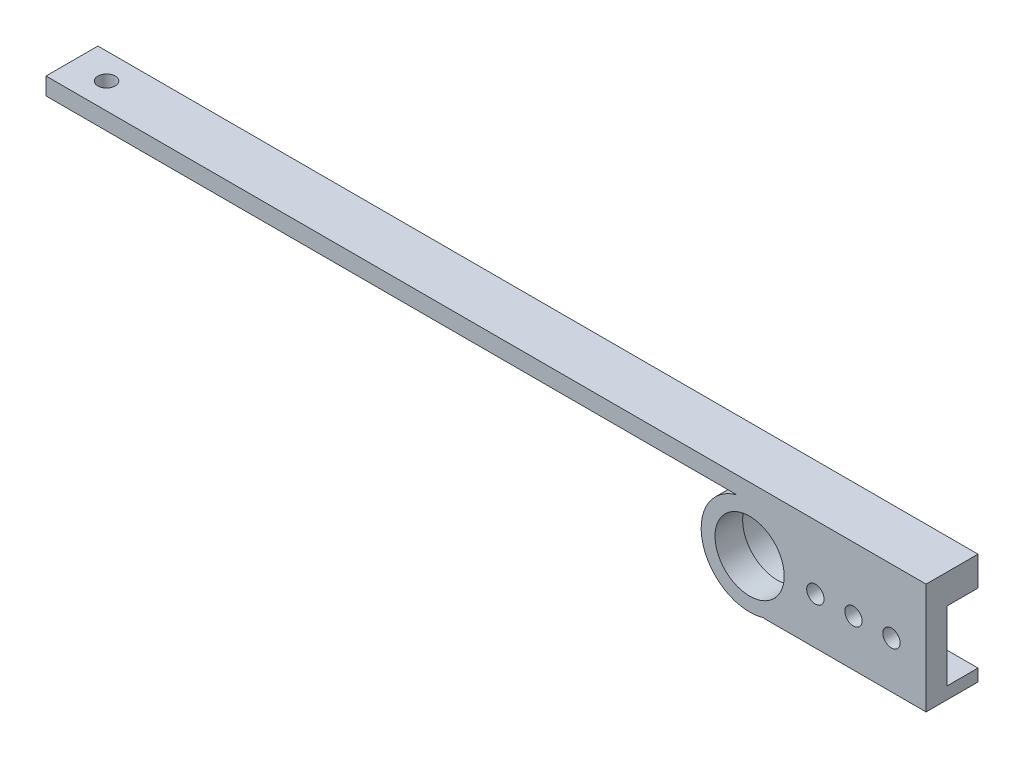
ISO-10303-21;
HEADER;
FILE_DESCRIPTION(('STEP AP214'),'2;1');
FILE_NAME('part.step','',(''),(''),'','','');
FILE_SCHEMA(('AUTOMOTIVE_DESIGN { 1 0 10303 214 1 1 1 1 }'));
ENDSEC;
DATA;
#1=APPLICATION_CONTEXT('core data for automotive mechanical design processes');
#2=APPLICATION_PROTOCOL_DEFINITION('international standard','automotive_design',2000,#1);
#3=PRODUCT_CONTEXT('',#1,'mechanical');
#4=PRODUCT('Part','Part','',(#3));
#5=PRODUCT_RELATED_PRODUCT_CATEGORY('part','',(#4));
#6=PRODUCT_DEFINITION_FORMATION('','',#4);
#7=PRODUCT_DEFINITION_CONTEXT('part definition',#1,'design');
#8=PRODUCT_DEFINITION('design','',#6,#7);
#9=PRODUCT_DEFINITION_SHAPE('','',#8);
#10=(LENGTH_UNIT() NAMED_UNIT(*) SI_UNIT(.MILLI.,.METRE.));
#11=(NAMED_UNIT(*) PLANE_ANGLE_UNIT() SI_UNIT($,.RADIAN.));
#12=(NAMED_UNIT(*) SI_UNIT($,.STERADIAN.) SOLID_ANGLE_UNIT());
#13=UNCERTAINTY_MEASURE_WITH_UNIT(LENGTH_MEASURE(1.E-05),#10,'distance_accuracy_value','');
#14=(GEOMETRIC_REPRESENTATION_CONTEXT(3) GLOBAL_UNCERTAINTY_ASSIGNED_CONTEXT((#13)) GLOBAL_UNIT_ASSIGNED_CONTEXT((#10,
#11,#12)) REPRESENTATION_CONTEXT('',''));
#15=CARTESIAN_POINT('',(0.,0.,0.));
#16=DIRECTION('',(0.,0.,1.));
#17=DIRECTION('',(1.,0.,0.));
#18=AXIS2_PLACEMENT_3D('',#15,#16,#17);
#19=CARTESIAN_POINT('',(-31.,0.,-9.));
#20=DIRECTION('',(0.,0.,1.));
#21=DIRECTION('',(1.,0.,0.));
#22=AXIS2_PLACEMENT_3D('',#19,#20,#21);
#23=CYLINDRICAL_SURFACE('',#22,11.);
#24=CARTESIAN_POINT('',(-31.,0.,-9.));
#25=DIRECTION('',(0.,0.,1.));
#26=DIRECTION('',(1.,0.,0.));
#27=AXIS2_PLACEMENT_3D('',#24,#25,#26);
#28=CIRCLE('',#27,11.);
#29=CARTESIAN_POINT('',(-20.,0.,-9.));
#30=VERTEX_POINT('',#29);
#31=EDGE_CURVE('E187',#30,#30,#28,.T.);
#32=ORIENTED_EDGE('',*,*,#31,.F.);
#33=EDGE_LOOP('',(#32));
#34=FACE_BOUND('',#33,.T.);
#35=CARTESIAN_POINT('',(-31.,0.,-2.));
#36=DIRECTION('',(0.,0.,1.));
#37=DIRECTION('',(1.,0.,0.));
#38=AXIS2_PLACEMENT_3D('',#35,#36,#37);
#39=CIRCLE('',#38,11.);
#40=CARTESIAN_POINT('',(-20.,0.,-2.));
#41=VERTEX_POINT('',#40);
#42=EDGE_CURVE('E11',#41,#41,#39,.F.);
#43=ORIENTED_EDGE('',*,*,#42,.F.);
#44=EDGE_LOOP('',(#43));
#45=FACE_BOUND('',#44,.T.);
#46=ADVANCED_FACE('F44',(#34,#45),#23,.F.);
#47=CARTESIAN_POINT('',(20.,-10.,6.));
#48=DIRECTION('',(-1.,0.,0.));
#49=DIRECTION('',(0.,0.,1.));
#50=AXIS2_PLACEMENT_3D('',#47,#48,#49);
#51=PLANE('',#50);
#52=DIRECTION('',(0.,1.,0.));
#53=VECTOR('',#52,1.);
#54=CARTESIAN_POINT('',(20.,-10.,0.));
#55=LINE('',#54,#53);
#56=CARTESIAN_POINT('',(20.,-10.,0.));
#57=VERTEX_POINT('',#56);
#58=CARTESIAN_POINT('',(20.,10.,0.));
#59=VERTEX_POINT('',#58);
#60=EDGE_CURVE('E312',#57,#59,#55,.T.);
#61=ORIENTED_EDGE('',*,*,#60,.T.);
#62=DIRECTION('',(0.,0.,1.));
#63=VECTOR('',#62,1.);
#64=CARTESIAN_POINT('',(20.,10.,-9.));
#65=LINE('',#64,#63);
#66=CARTESIAN_POINT('',(20.,10.,-9.));
#67=VERTEX_POINT('',#66);
#68=EDGE_CURVE('E264',#67,#59,#65,.T.);
#69=ORIENTED_EDGE('',*,*,#68,.F.);
#70=DIRECTION('',(0.,-1.,0.));
#71=VECTOR('',#70,1.);
#72=CARTESIAN_POINT('',(20.,0.,-9.));
#73=LINE('',#72,#71);
#74=CARTESIAN_POINT('',(20.,18.5,-9.));
#75=VERTEX_POINT('',#74);
#76=EDGE_CURVE('E203',#75,#67,#73,.T.);
#77=ORIENTED_EDGE('',*,*,#76,.F.);
#78=DIRECTION('',(0.,0.,1.));
#79=VECTOR('',#78,1.);
#80=CARTESIAN_POINT('',(20.,18.5,6.));
#81=LINE('',#80,#79);
#82=CARTESIAN_POINT('',(20.,18.5,6.));
#83=VERTEX_POINT('',#82);
#84=EDGE_CURVE('E162',#75,#83,#81,.T.);
#85=ORIENTED_EDGE('',*,*,#84,.T.);
#86=DIRECTION('',(0.,1.,0.));
#87=VECTOR('',#86,1.);
#88=CARTESIAN_POINT('',(20.,-10.,6.));
#89=LINE('',#88,#87);
#90=CARTESIAN_POINT('',(20.,-13.5,6.));
#91=VERTEX_POINT('',#90);
#92=EDGE_CURVE('E299',#91,#83,#89,.T.);
#93=ORIENTED_EDGE('',*,*,#92,.F.);
#94=DIRECTION('',(0.,0.,1.));
#95=VECTOR('',#94,1.);
#96=CARTESIAN_POINT('',(20.,-13.5,-9.));
#97=LINE('',#96,#95);
#98=CARTESIAN_POINT('',(20.,-13.5,-9.));
#99=VERTEX_POINT('',#98);
#100=EDGE_CURVE('E252',#99,#91,#97,.T.);
#101=ORIENTED_EDGE('',*,*,#100,.F.);
#102=DIRECTION('',(0.,-1.,0.));
#103=VECTOR('',#102,1.);
#104=CARTESIAN_POINT('',(20.,0.,-9.));
#105=LINE('',#104,#103);
#106=CARTESIAN_POINT('',(20.,-10.,-9.));
#107=VERTEX_POINT('',#106);
#108=EDGE_CURVE('E217',#107,#99,#105,.T.);
#109=ORIENTED_EDGE('',*,*,#108,.F.);
#110=DIRECTION('',(0.,0.,1.));
#111=VECTOR('',#110,1.);
#112=CARTESIAN_POINT('',(20.,-10.,-9.));
#113=LINE('',#112,#111);
#114=EDGE_CURVE('E248',#107,#57,#113,.T.);
#115=ORIENTED_EDGE('',*,*,#114,.T.);
#116=EDGE_LOOP('',(#61,#69,#77,#85,#93,#101,#109,#115));
#117=FACE_BOUND('',#116,.T.);
#118=ADVANCED_FACE('F46',(#117),#51,.F.);
#119=CARTESIAN_POINT('',(0.,0.,6.));
#120=DIRECTION('',(0.,0.,1.));
#121=DIRECTION('',(1.,0.,0.));
#122=AXIS2_PLACEMENT_3D('',#119,#120,#121);
#123=PLANE('',#122);
#124=DIRECTION('',(0.,1.,0.));
#125=VECTOR('',#124,1.);
#126=CARTESIAN_POINT('',(-234.316253666261,0.,6.));
#127=LINE('',#126,#125);
#128=CARTESIAN_POINT('',(-234.316253666261,13.5,6.));
#129=VERTEX_POINT('',#128);
#130=CARTESIAN_POINT('',(-234.316253666261,18.5,6.));
#131=VERTEX_POINT('',#130);
#132=EDGE_CURVE('E60',#129,#131,#127,.T.);
#133=ORIENTED_EDGE('',*,*,#132,.F.);
#134=DIRECTION('',(1.,0.,0.));
#135=VECTOR('',#134,1.);
#136=CARTESIAN_POINT('',(-480.,13.5,6.));
#137=LINE('',#136,#135);
#138=CARTESIAN_POINT('',(-34.7080992435478,13.5,6.));
#139=VERTEX_POINT('',#138);
#140=EDGE_CURVE('E170',#129,#139,#137,.T.);
#141=ORIENTED_EDGE('',*,*,#140,.T.);
#142=CARTESIAN_POINT('',(-31.,0.,6.));
#143=DIRECTION('',(0.,0.,1.));
#144=DIRECTION('',(1.,0.,0.));
#145=AXIS2_PLACEMENT_3D('',#142,#143,#144);
#146=CIRCLE('',#145,14.);
#147=CARTESIAN_POINT('',(-26.8939671408107,-13.3843376436512,6.));
#148=VERTEX_POINT('',#147);
#149=EDGE_CURVE('E183',#139,#148,#146,.T.);
#150=ORIENTED_EDGE('',*,*,#149,.T.);
#151=DIRECTION('',(0.,1.,0.));
#152=VECTOR('',#151,1.);
#153=CARTESIAN_POINT('',(-26.8939671408107,0.,6.));
#154=LINE('',#153,#152);
#155=CARTESIAN_POINT('',(-26.8939671408107,-13.5,6.));
#156=VERTEX_POINT('',#155);
#157=EDGE_CURVE('E232',#156,#148,#154,.T.);
#158=ORIENTED_EDGE('',*,*,#157,.F.);
#159=DIRECTION('',(-1.,0.,0.));
#160=VECTOR('',#159,1.);
#161=CARTESIAN_POINT('',(0.,-13.5,6.));
#162=LINE('',#161,#160);
#163=EDGE_CURVE('E192',#91,#156,#162,.T.);
#164=ORIENTED_EDGE('',*,*,#163,.F.);
#165=ORIENTED_EDGE('',*,*,#92,.T.);
#166=DIRECTION('',(1.,0.,0.));
#167=VECTOR('',#166,1.);
#168=CARTESIAN_POINT('',(-480.,18.5,6.));
#169=LINE('',#168,#167);
#170=EDGE_CURVE('E164',#131,#83,#169,.T.);
#171=ORIENTED_EDGE('',*,*,#170,.F.);
#172=EDGE_LOOP('',(#133,#141,#150,#158,#164,#165,#171));
#173=FACE_BOUND('',#172,.T.);
#174=CARTESIAN_POINT('',(10.,0.,6.));
#175=DIRECTION('',(0.,0.,1.));
#176=DIRECTION('',(1.,0.,0.));
#177=AXIS2_PLACEMENT_3D('',#174,#175,#176);
#178=CIRCLE('',#177,2.5);
#179=CARTESIAN_POINT('',(12.5,0.,6.));
#180=VERTEX_POINT('',#179);
#181=EDGE_CURVE('E280',#180,#180,#178,.T.);
#182=ORIENTED_EDGE('',*,*,#181,.F.);
#183=EDGE_LOOP('',(#182));
#184=FACE_BOUND('',#183,.T.);
#185=CARTESIAN_POINT('',(-0.999999999999999,0.,6.));
#186=DIRECTION('',(0.,0.,1.));
#187=DIRECTION('',(1.,0.,0.));
#188=AXIS2_PLACEMENT_3D('',#185,#186,#187);
#189=CIRCLE('',#188,2.5);
#190=CARTESIAN_POINT('',(1.5,0.,6.));
#191=VERTEX_POINT('',#190);
#192=EDGE_CURVE('E284',#191,#191,#189,.T.);
#193=ORIENTED_EDGE('',*,*,#192,.F.);
#194=EDGE_LOOP('',(#193));
#195=FACE_BOUND('',#194,.T.);
#196=CARTESIAN_POINT('',(-12.,-1.53625178909098E-13,6.));
#197=DIRECTION('',(0.,0.,1.));
#198=DIRECTION('',(1.,0.,0.));
#199=AXIS2_PLACEMENT_3D('',#196,#197,#198);
#200=CIRCLE('',#199,2.5);
#201=CARTESIAN_POINT('',(-9.5,-1.53625178909098E-13,6.));
#202=VERTEX_POINT('',#201);
#203=EDGE_CURVE('E292',#202,#202,#200,.T.);
#204=ORIENTED_EDGE('',*,*,#203,.F.);
#205=EDGE_LOOP('',(#204));
#206=FACE_BOUND('',#205,.T.);
#207=CARTESIAN_POINT('',(-31.,0.,6.));
#208=DIRECTION('',(0.,0.,1.));
#209=DIRECTION('',(1.,0.,0.));
#210=AXIS2_PLACEMENT_3D('',#207,#208,#209);
#211=CIRCLE('',#210,10.);
#212=CARTESIAN_POINT('',(-21.,0.,6.));
#213=VERTEX_POINT('',#212);
#214=EDGE_CURVE('E178',#213,#213,#211,.T.);
#215=ORIENTED_EDGE('',*,*,#214,.F.);
#216=EDGE_LOOP('',(#215));
#217=FACE_BOUND('',#216,.T.);
#218=ADVANCED_FACE('F353',(#173,#184,#195,#206,#217),#123,.T.);
#219=CARTESIAN_POINT('',(0.,0.,0.));
#220=DIRECTION('',(0.,0.,1.));
#221=DIRECTION('',(1.,0.,0.));
#222=AXIS2_PLACEMENT_3D('',#219,#220,#221);
#223=PLANE('',#222);
#224=CARTESIAN_POINT('',(10.,0.,0.));
#225=DIRECTION('',(0.,0.,1.));
#226=DIRECTION('',(1.,0.,0.));
#227=AXIS2_PLACEMENT_3D('',#224,#225,#226);
#228=CIRCLE('',#227,2.5);
#229=CARTESIAN_POINT('',(12.5,0.,0.));
#230=VERTEX_POINT('',#229);
#231=EDGE_CURVE('E275',#230,#230,#228,.T.);
#232=ORIENTED_EDGE('',*,*,#231,.T.);
#233=EDGE_LOOP('',(#232));
#234=FACE_BOUND('',#233,.T.);
#235=CARTESIAN_POINT('',(-0.999999999999999,0.,0.));
#236=DIRECTION('',(0.,0.,1.));
#237=DIRECTION('',(1.,0.,0.));
#238=AXIS2_PLACEMENT_3D('',#235,#236,#237);
#239=CIRCLE('',#238,2.5);
#240=CARTESIAN_POINT('',(1.5,0.,0.));
#241=VERTEX_POINT('',#240);
#242=EDGE_CURVE('E288',#241,#241,#239,.T.);
#243=ORIENTED_EDGE('',*,*,#242,.T.);
#244=EDGE_LOOP('',(#243));
#245=FACE_BOUND('',#244,.T.);
#246=CARTESIAN_POINT('',(-12.,-1.53625178909098E-13,0.));
#247=DIRECTION('',(0.,0.,1.));
#248=DIRECTION('',(1.,0.,0.));
#249=AXIS2_PLACEMENT_3D('',#246,#247,#248);
#250=CIRCLE('',#249,2.5);
#251=CARTESIAN_POINT('',(-9.5,-1.53625178909098E-13,0.));
#252=VERTEX_POINT('',#251);
#253=EDGE_CURVE('E243',#252,#252,#250,.T.);
#254=ORIENTED_EDGE('',*,*,#253,.T.);
#255=EDGE_LOOP('',(#254));
#256=FACE_BOUND('',#255,.T.);
#257=DIRECTION('',(0.,-1.,0.));
#258=VECTOR('',#257,1.);
#259=CARTESIAN_POINT('',(-20.,-10.,0.));
#260=LINE('',#259,#258);
#261=CARTESIAN_POINT('',(-20.,-8.66025403784439,0.));
#262=VERTEX_POINT('',#261);
#263=CARTESIAN_POINT('',(-20.,-10.,0.));
#264=VERTEX_POINT('',#263);
#265=EDGE_CURVE('E279',#262,#264,#260,.T.);
#266=ORIENTED_EDGE('',*,*,#265,.F.);
#267=CARTESIAN_POINT('',(-31.,0.,0.));
#268=DIRECTION('',(0.,0.,1.));
#269=DIRECTION('',(1.,0.,0.));
#270=AXIS2_PLACEMENT_3D('',#267,#268,#269);
#271=CIRCLE('',#270,14.);
#272=CARTESIAN_POINT('',(-20.,8.66025403784439,0.));
#273=VERTEX_POINT('',#272);
#274=EDGE_CURVE('E53',#262,#273,#271,.T.);
#275=ORIENTED_EDGE('',*,*,#274,.T.);
#276=CARTESIAN_POINT('',(-20.,10.,0.));
#277=VERTEX_POINT('',#276);
#278=EDGE_CURVE('E304',#277,#273,#260,.T.);
#279=ORIENTED_EDGE('',*,*,#278,.F.);
#280=DIRECTION('',(-1.,0.,0.));
#281=VECTOR('',#280,1.);
#282=CARTESIAN_POINT('',(20.,10.,0.));
#283=LINE('',#282,#281);
#284=EDGE_CURVE('E303',#59,#277,#283,.T.);
#285=ORIENTED_EDGE('',*,*,#284,.F.);
#286=ORIENTED_EDGE('',*,*,#60,.F.);
#287=DIRECTION('',(1.,0.,0.));
#288=VECTOR('',#287,1.);
#289=CARTESIAN_POINT('',(20.,-10.,0.));
#290=LINE('',#289,#288);
#291=EDGE_CURVE('E308',#264,#57,#290,.T.);
#292=ORIENTED_EDGE('',*,*,#291,.F.);
#293=EDGE_LOOP('',(#266,#275,#279,#285,#286,#292));
#294=FACE_BOUND('',#293,.T.);
#295=ADVANCED_FACE('F320',(#234,#245,#256,#294),#223,.F.);
#296=CARTESIAN_POINT('',(-12.,-1.53625178909098E-13,0.));
#297=DIRECTION('',(0.,0.,1.));
#298=DIRECTION('',(1.,0.,0.));
#299=AXIS2_PLACEMENT_3D('',#296,#297,#298);
#300=CYLINDRICAL_SURFACE('',#299,2.5);
#301=ORIENTED_EDGE('',*,*,#253,.F.);
#302=EDGE_LOOP('',(#301));
#303=FACE_BOUND('',#302,.T.);
#304=ORIENTED_EDGE('',*,*,#203,.T.);
#305=EDGE_LOOP('',(#304));
#306=FACE_BOUND('',#305,.T.);
#307=ADVANCED_FACE('F400',(#303,#306),#300,.F.);
#308=CARTESIAN_POINT('',(-0.999999999999999,0.,0.));
#309=DIRECTION('',(0.,0.,1.));
#310=DIRECTION('',(1.,0.,0.));
#311=AXIS2_PLACEMENT_3D('',#308,#309,#310);
#312=CYLINDRICAL_SURFACE('',#311,2.5);
#313=ORIENTED_EDGE('',*,*,#242,.F.);
#314=EDGE_LOOP('',(#313));
#315=FACE_BOUND('',#314,.T.);
#316=ORIENTED_EDGE('',*,*,#192,.T.);
#317=EDGE_LOOP('',(#316));
#318=FACE_BOUND('',#317,.T.);
#319=ADVANCED_FACE('F396',(#315,#318),#312,.F.);
#320=CARTESIAN_POINT('',(10.,0.,0.));
#321=DIRECTION('',(0.,0.,1.));
#322=DIRECTION('',(1.,0.,0.));
#323=AXIS2_PLACEMENT_3D('',#320,#321,#322);
#324=CYLINDRICAL_SURFACE('',#323,2.5);
#325=ORIENTED_EDGE('',*,*,#231,.F.);
#326=EDGE_LOOP('',(#325));
#327=FACE_BOUND('',#326,.T.);
#328=ORIENTED_EDGE('',*,*,#181,.T.);
#329=EDGE_LOOP('',(#328));
#330=FACE_BOUND('',#329,.T.);
#331=ADVANCED_FACE('F393',(#327,#330),#324,.F.);
#332=CARTESIAN_POINT('',(-31.,0.,-9.));
#333=DIRECTION('',(0.,0.,1.));
#334=DIRECTION('',(1.,0.,0.));
#335=AXIS2_PLACEMENT_3D('',#332,#333,#334);
#336=CYLINDRICAL_SURFACE('',#335,14.);
#337=ORIENTED_EDGE('',*,*,#274,.F.);
#338=DIRECTION('',(0.,0.,1.));
#339=VECTOR('',#338,1.);
#340=CARTESIAN_POINT('',(-20.,-8.66025403784439,-9.));
#341=LINE('',#340,#339);
#342=CARTESIAN_POINT('',(-20.,-8.66025403784439,-9.));
#343=VERTEX_POINT('',#342);
#344=EDGE_CURVE('E239',#343,#262,#341,.T.);
#345=ORIENTED_EDGE('',*,*,#344,.F.);
#346=CARTESIAN_POINT('',(-31.,0.,-9.));
#347=DIRECTION('',(0.,0.,1.));
#348=DIRECTION('',(1.,0.,0.));
#349=AXIS2_PLACEMENT_3D('',#346,#347,#348);
#350=CIRCLE('',#349,14.);
#351=CARTESIAN_POINT('',(-20.,8.66025403784439,-9.));
#352=VERTEX_POINT('',#351);
#353=EDGE_CURVE('E191',#343,#352,#350,.T.);
#354=ORIENTED_EDGE('',*,*,#353,.T.);
#355=DIRECTION('',(0.,0.,1.));
#356=VECTOR('',#355,1.);
#357=CARTESIAN_POINT('',(-20.,8.66025403784439,-9.));
#358=LINE('',#357,#356);
#359=EDGE_CURVE('E229',#352,#273,#358,.T.);
#360=ORIENTED_EDGE('',*,*,#359,.T.);
#361=EDGE_LOOP('',(#337,#345,#354,#360));
#362=FACE_BOUND('',#361,.T.);
#363=ADVANCED_FACE('F328',(#362),#336,.T.);
#364=CARTESIAN_POINT('',(-20.,0.,-9.));
#365=DIRECTION('',(-1.,0.,0.));
#366=DIRECTION('',(0.,0.,1.));
#367=AXIS2_PLACEMENT_3D('',#364,#365,#366);
#368=PLANE('',#367);
#369=ORIENTED_EDGE('',*,*,#344,.T.);
#370=ORIENTED_EDGE('',*,*,#265,.T.);
#371=DIRECTION('',(0.,0.,1.));
#372=VECTOR('',#371,1.);
#373=CARTESIAN_POINT('',(-20.,-10.,-9.));
#374=LINE('',#373,#372);
#375=CARTESIAN_POINT('',(-20.,-10.,-9.));
#376=VERTEX_POINT('',#375);
#377=EDGE_CURVE('E244',#376,#264,#374,.T.);
#378=ORIENTED_EDGE('',*,*,#377,.F.);
#379=DIRECTION('',(0.,-1.,0.));
#380=VECTOR('',#379,1.);
#381=CARTESIAN_POINT('',(-20.,0.,-9.));
#382=LINE('',#381,#380);
#383=EDGE_CURVE('E225',#343,#376,#382,.T.);
#384=ORIENTED_EDGE('',*,*,#383,.F.);
#385=EDGE_LOOP('',(#369,#370,#378,#384));
#386=FACE_BOUND('',#385,.T.);
#387=ADVANCED_FACE('F436',(#386),#368,.F.);
#388=CARTESIAN_POINT('',(0.,-10.,-9.));
#389=DIRECTION('',(0.,-1.,0.));
#390=DIRECTION('',(1.,0.,0.));
#391=AXIS2_PLACEMENT_3D('',#388,#389,#390);
#392=PLANE('',#391);
#393=ORIENTED_EDGE('',*,*,#377,.T.);
#394=ORIENTED_EDGE('',*,*,#291,.T.);
#395=ORIENTED_EDGE('',*,*,#114,.F.);
#396=DIRECTION('',(1.,0.,0.));
#397=VECTOR('',#396,1.);
#398=CARTESIAN_POINT('',(0.,-10.,-9.));
#399=LINE('',#398,#397);
#400=EDGE_CURVE('E221',#376,#107,#399,.T.);
#401=ORIENTED_EDGE('',*,*,#400,.F.);
#402=EDGE_LOOP('',(#393,#394,#395,#401));
#403=FACE_BOUND('',#402,.T.);
#404=ADVANCED_FACE('F338',(#403),#392,.F.);
#405=CARTESIAN_POINT('',(0.,10.,-9.));
#406=DIRECTION('',(0.,1.,0.));
#407=DIRECTION('',(-1.,0.,0.));
#408=AXIS2_PLACEMENT_3D('',#405,#406,#407);
#409=PLANE('',#408);
#410=ORIENTED_EDGE('',*,*,#68,.T.);
#411=ORIENTED_EDGE('',*,*,#284,.T.);
#412=DIRECTION('',(0.,0.,1.));
#413=VECTOR('',#412,1.);
#414=CARTESIAN_POINT('',(-20.,10.,-9.));
#415=LINE('',#414,#413);
#416=CARTESIAN_POINT('',(-20.,10.,-9.));
#417=VERTEX_POINT('',#416);
#418=EDGE_CURVE('E268',#417,#277,#415,.T.);
#419=ORIENTED_EDGE('',*,*,#418,.F.);
#420=DIRECTION('',(-1.,0.,0.));
#421=VECTOR('',#420,1.);
#422=CARTESIAN_POINT('',(0.,10.,-9.));
#423=LINE('',#422,#421);
#424=EDGE_CURVE('E199',#67,#417,#423,.T.);
#425=ORIENTED_EDGE('',*,*,#424,.F.);
#426=EDGE_LOOP('',(#410,#411,#419,#425));
#427=FACE_BOUND('',#426,.T.);
#428=ADVANCED_FACE('F334',(#427),#409,.F.);
#429=CARTESIAN_POINT('',(-20.,0.,-9.));
#430=DIRECTION('',(-1.,0.,0.));
#431=DIRECTION('',(0.,0.,1.));
#432=AXIS2_PLACEMENT_3D('',#429,#430,#431);
#433=PLANE('',#432);
#434=ORIENTED_EDGE('',*,*,#418,.T.);
#435=ORIENTED_EDGE('',*,*,#278,.T.);
#436=ORIENTED_EDGE('',*,*,#359,.F.);
#437=DIRECTION('',(0.,-1.,0.));
#438=VECTOR('',#437,1.);
#439=CARTESIAN_POINT('',(-20.,0.,-9.));
#440=LINE('',#439,#438);
#441=EDGE_CURVE('E196',#417,#352,#440,.T.);
#442=ORIENTED_EDGE('',*,*,#441,.F.);
#443=EDGE_LOOP('',(#434,#435,#436,#442));
#444=FACE_BOUND('',#443,.T.);
#445=ADVANCED_FACE('F326',(#444),#433,.F.);
#446=CARTESIAN_POINT('',(0.,-13.5,-9.));
#447=DIRECTION('',(0.,1.,0.));
#448=DIRECTION('',(0.,0.,1.));
#449=AXIS2_PLACEMENT_3D('',#446,#447,#448);
#450=PLANE('',#449);
#451=ORIENTED_EDGE('',*,*,#163,.T.);
#452=DIRECTION('',(0.,0.,1.));
#453=VECTOR('',#452,1.);
#454=CARTESIAN_POINT('',(-26.8939671408107,-13.5,-9.));
#455=LINE('',#454,#453);
#456=CARTESIAN_POINT('',(-26.8939671408107,-13.5,-9.));
#457=VERTEX_POINT('',#456);
#458=EDGE_CURVE('E256',#457,#156,#455,.T.);
#459=ORIENTED_EDGE('',*,*,#458,.F.);
#460=DIRECTION('',(-1.,0.,0.));
#461=VECTOR('',#460,1.);
#462=CARTESIAN_POINT('',(0.,-13.5,-9.));
#463=LINE('',#462,#461);
#464=EDGE_CURVE('E213',#99,#457,#463,.T.);
#465=ORIENTED_EDGE('',*,*,#464,.F.);
#466=ORIENTED_EDGE('',*,*,#100,.T.);
#467=EDGE_LOOP('',(#451,#459,#465,#466));
#468=FACE_BOUND('',#467,.T.);
#469=ADVANCED_FACE('F343',(#468),#450,.F.);
#470=CARTESIAN_POINT('',(-26.8939671408107,0.,-9.));
#471=DIRECTION('',(1.,0.,0.));
#472=DIRECTION('',(0.,0.,-1.));
#473=AXIS2_PLACEMENT_3D('',#470,#471,#472);
#474=PLANE('',#473);
#475=ORIENTED_EDGE('',*,*,#157,.T.);
#476=DIRECTION('',(0.,0.,1.));
#477=VECTOR('',#476,1.);
#478=CARTESIAN_POINT('',(-26.8939671408107,-13.3843376436512,-9.));
#479=LINE('',#478,#477);
#480=CARTESIAN_POINT('',(-26.8939671408107,-13.3843376436512,-9.));
#481=VERTEX_POINT('',#480);
#482=EDGE_CURVE('E260',#481,#148,#479,.T.);
#483=ORIENTED_EDGE('',*,*,#482,.F.);
#484=DIRECTION('',(0.,1.,0.));
#485=VECTOR('',#484,1.);
#486=CARTESIAN_POINT('',(-26.8939671408107,0.,-9.));
#487=LINE('',#486,#485);
#488=EDGE_CURVE('E209',#457,#481,#487,.T.);
#489=ORIENTED_EDGE('',*,*,#488,.F.);
#490=ORIENTED_EDGE('',*,*,#458,.T.);
#491=EDGE_LOOP('',(#475,#483,#489,#490));
#492=FACE_BOUND('',#491,.T.);
#493=ADVANCED_FACE('F346',(#492),#474,.F.);
#494=CARTESIAN_POINT('',(-31.,0.,-9.));
#495=DIRECTION('',(0.,0.,1.));
#496=DIRECTION('',(1.,0.,0.));
#497=AXIS2_PLACEMENT_3D('',#494,#495,#496);
#498=CYLINDRICAL_SURFACE('',#497,14.);
#499=DIRECTION('',(0.,0.,1.));
#500=VECTOR('',#499,1.);
#501=CARTESIAN_POINT('',(-34.7080992435478,13.5,-9.));
#502=LINE('',#501,#500);
#503=CARTESIAN_POINT('',(-34.7080992435478,13.5,-9.));
#504=VERTEX_POINT('',#503);
#505=EDGE_CURVE('E168',#504,#139,#502,.T.);
#506=ORIENTED_EDGE('',*,*,#505,.F.);
#507=CARTESIAN_POINT('',(-31.,0.,-9.));
#508=DIRECTION('',(0.,0.,1.));
#509=DIRECTION('',(1.,0.,0.));
#510=AXIS2_PLACEMENT_3D('',#507,#508,#509);
#511=CIRCLE('',#510,14.);
#512=EDGE_CURVE('E206',#504,#481,#511,.T.);
#513=ORIENTED_EDGE('',*,*,#512,.T.);
#514=ORIENTED_EDGE('',*,*,#482,.T.);
#515=ORIENTED_EDGE('',*,*,#149,.F.);
#516=EDGE_LOOP('',(#506,#513,#514,#515));
#517=FACE_BOUND('',#516,.T.);
#518=ADVANCED_FACE('F349',(#517),#498,.T.);
#519=CARTESIAN_POINT('',(0.,0.,-9.));
#520=DIRECTION('',(0.,0.,1.));
#521=DIRECTION('',(1.,0.,0.));
#522=AXIS2_PLACEMENT_3D('',#519,#520,#521);
#523=PLANE('',#522);
#524=DIRECTION('',(1.,0.,0.));
#525=VECTOR('',#524,1.);
#526=CARTESIAN_POINT('',(-480.,13.5,-9.));
#527=LINE('',#526,#525);
#528=CARTESIAN_POINT('',(-234.316253666262,13.5,-9.));
#529=VERTEX_POINT('',#528);
#530=EDGE_CURVE('E68',#529,#504,#527,.T.);
#531=ORIENTED_EDGE('',*,*,#530,.F.);
#532=DIRECTION('',(0.,1.,0.));
#533=VECTOR('',#532,1.);
#534=CARTESIAN_POINT('',(-234.316253666262,0.,-9.));
#535=LINE('',#534,#533);
#536=CARTESIAN_POINT('',(-234.316253666262,18.5,-9.));
#537=VERTEX_POINT('',#536);
#538=EDGE_CURVE('E142',#529,#537,#535,.T.);
#539=ORIENTED_EDGE('',*,*,#538,.T.);
#540=DIRECTION('',(1.,0.,0.));
#541=VECTOR('',#540,1.);
#542=CARTESIAN_POINT('',(-480.,18.5,-9.));
#543=LINE('',#542,#541);
#544=EDGE_CURVE('E154',#537,#75,#543,.T.);
#545=ORIENTED_EDGE('',*,*,#544,.T.);
#546=ORIENTED_EDGE('',*,*,#76,.T.);
#547=ORIENTED_EDGE('',*,*,#424,.T.);
#548=ORIENTED_EDGE('',*,*,#441,.T.);
#549=ORIENTED_EDGE('',*,*,#353,.F.);
#550=ORIENTED_EDGE('',*,*,#383,.T.);
#551=ORIENTED_EDGE('',*,*,#400,.T.);
#552=ORIENTED_EDGE('',*,*,#108,.T.);
#553=ORIENTED_EDGE('',*,*,#464,.T.);
#554=ORIENTED_EDGE('',*,*,#488,.T.);
#555=ORIENTED_EDGE('',*,*,#512,.F.);
#556=EDGE_LOOP('',(#531,#539,#545,#546,#547,#548,#549,#550,#551,#552,#553,#554,#555));
#557=FACE_BOUND('',#556,.T.);
#558=ORIENTED_EDGE('',*,*,#31,.T.);
#559=EDGE_LOOP('',(#558));
#560=FACE_BOUND('',#559,.T.);
#561=ADVANCED_FACE('F151',(#557,#560),#523,.F.);
#562=CARTESIAN_POINT('',(-31.,0.,-2.));
#563=DIRECTION('',(0.,0.,1.));
#564=DIRECTION('',(1.,0.,0.));
#565=AXIS2_PLACEMENT_3D('',#562,#563,#564);
#566=PLANE('',#565);
#567=CARTESIAN_POINT('',(-31.,0.,-2.));
#568=DIRECTION('',(0.,0.,1.));
#569=DIRECTION('',(1.,0.,0.));
#570=AXIS2_PLACEMENT_3D('',#567,#568,#569);
#571=CIRCLE('',#570,10.);
#572=CARTESIAN_POINT('',(-21.,0.,-2.));
#573=VERTEX_POINT('',#572);
#574=EDGE_CURVE('E179',#573,#573,#571,.T.);
#575=ORIENTED_EDGE('',*,*,#574,.T.);
#576=EDGE_LOOP('',(#575));
#577=FACE_BOUND('',#576,.T.);
#578=ORIENTED_EDGE('',*,*,#42,.T.);
#579=EDGE_LOOP('',(#578));
#580=FACE_BOUND('',#579,.T.);
#581=ADVANCED_FACE('F423',(#577,#580),#566,.F.);
#582=CARTESIAN_POINT('',(-31.,0.,-2.));
#583=DIRECTION('',(0.,0.,1.));
#584=DIRECTION('',(1.,0.,0.));
#585=AXIS2_PLACEMENT_3D('',#582,#583,#584);
#586=CYLINDRICAL_SURFACE('',#585,10.);
#587=ORIENTED_EDGE('',*,*,#574,.F.);
#588=EDGE_LOOP('',(#587));
#589=FACE_BOUND('',#588,.T.);
#590=ORIENTED_EDGE('',*,*,#214,.T.);
#591=EDGE_LOOP('',(#590));
#592=FACE_BOUND('',#591,.T.);
#593=ADVANCED_FACE('F379',(#589,#592),#586,.F.);
#594=CARTESIAN_POINT('',(-480.,13.5,6.));
#595=DIRECTION('',(0.,-1.,0.));
#596=DIRECTION('',(0.,0.,-1.));
#597=AXIS2_PLACEMENT_3D('',#594,#595,#596);
#598=PLANE('',#597);
#599=CARTESIAN_POINT('',(-224.316253666262,13.5,-1.5));
#600=DIRECTION('',(0.,-1.,0.));
#601=DIRECTION('',(0.,0.,-1.));
#602=AXIS2_PLACEMENT_3D('',#599,#600,#601);
#603=CIRCLE('',#602,2.5);
#604=CARTESIAN_POINT('',(-224.316253666262,13.5,-3.99999999999999));
#605=VERTEX_POINT('',#604);
#606=EDGE_CURVE('E148',#605,#605,#603,.T.);
#607=ORIENTED_EDGE('',*,*,#606,.F.);
#608=EDGE_LOOP('',(#607));
#609=FACE_BOUND('',#608,.T.);
#610=DIRECTION('',(0.,0.,1.));
#611=VECTOR('',#610,1.);
#612=CARTESIAN_POINT('',(-234.316253666261,13.5,5.99999999997987));
#613=LINE('',#612,#611);
#614=EDGE_CURVE('E147',#529,#129,#613,.T.);
#615=ORIENTED_EDGE('',*,*,#614,.F.);
#616=ORIENTED_EDGE('',*,*,#530,.T.);
#617=ORIENTED_EDGE('',*,*,#505,.T.);
#618=ORIENTED_EDGE('',*,*,#140,.F.);
#619=EDGE_LOOP('',(#615,#616,#617,#618));
#620=FACE_BOUND('',#619,.T.);
#621=ADVANCED_FACE('F351',(#609,#620),#598,.T.);
#622=CARTESIAN_POINT('',(-480.,18.5,6.));
#623=DIRECTION('',(0.,1.,0.));
#624=DIRECTION('',(0.,0.,1.));
#625=AXIS2_PLACEMENT_3D('',#622,#623,#624);
#626=PLANE('',#625);
#627=CARTESIAN_POINT('',(-224.316253666262,18.5,-1.5));
#628=DIRECTION('',(0.,1.,0.));
#629=DIRECTION('',(0.,0.,1.));
#630=AXIS2_PLACEMENT_3D('',#627,#628,#629);
#631=CIRCLE('',#630,2.5);
#632=CARTESIAN_POINT('',(-224.316253666262,18.5,0.999999999999996));
#633=VERTEX_POINT('',#632);
#634=EDGE_CURVE('E364',#633,#633,#631,.T.);
#635=ORIENTED_EDGE('',*,*,#634,.F.);
#636=EDGE_LOOP('',(#635));
#637=FACE_BOUND('',#636,.T.);
#638=DIRECTION('',(0.,0.,-1.));
#639=VECTOR('',#638,1.);
#640=CARTESIAN_POINT('',(-234.31625366626,18.5,11.8998639654802));
#641=LINE('',#640,#639);
#642=EDGE_CURVE('E139',#131,#537,#641,.T.);
#643=ORIENTED_EDGE('',*,*,#642,.F.);
#644=ORIENTED_EDGE('',*,*,#170,.T.);
#645=ORIENTED_EDGE('',*,*,#84,.F.);
#646=ORIENTED_EDGE('',*,*,#544,.F.);
#647=EDGE_LOOP('',(#643,#644,#645,#646));
#648=FACE_BOUND('',#647,.T.);
#649=ADVANCED_FACE('F160',(#637,#648),#626,.T.);
#650=CARTESIAN_POINT('',(-234.31625366626,-14.,11.8998639654802));
#651=DIRECTION('',(1.,0.,0.));
#652=DIRECTION('',(0.,0.,-1.));
#653=AXIS2_PLACEMENT_3D('',#650,#651,#652);
#654=PLANE('',#653);
#655=ORIENTED_EDGE('',*,*,#132,.T.);
#656=ORIENTED_EDGE('',*,*,#642,.T.);
#657=ORIENTED_EDGE('',*,*,#538,.F.);
#658=ORIENTED_EDGE('',*,*,#614,.T.);
#659=EDGE_LOOP('',(#655,#656,#657,#658));
#660=FACE_BOUND('',#659,.T.);
#661=ADVANCED_FACE('F141',(#660),#654,.F.);
#662=CARTESIAN_POINT('',(-224.316253666262,-14.,-1.5));
#663=DIRECTION('',(0.,1.,0.));
#664=DIRECTION('',(0.,0.,1.));
#665=AXIS2_PLACEMENT_3D('',#662,#663,#664);
#666=CYLINDRICAL_SURFACE('',#665,2.5);
#667=ORIENTED_EDGE('',*,*,#606,.T.);
#668=EDGE_LOOP('',(#667));
#669=FACE_BOUND('',#668,.T.);
#670=ORIENTED_EDGE('',*,*,#634,.T.);
#671=EDGE_LOOP('',(#670));
#672=FACE_BOUND('',#671,.T.);
#673=ADVANCED_FACE('F369',(#669,#672),#666,.F.);
#674=CLOSED_SHELL('',(#46,#118,#218,#295,#307,#319,#331,#363,#387,#404,#428,#445,#469,#493,#518,
#561,#581,#593,#621,#649,#661,#673));
#675=MANIFOLD_SOLID_BREP('B2',#674);
#676=ADVANCED_BREP_SHAPE_REPRESENTATION('',(#18,#675),#14);
#677=SHAPE_DEFINITION_REPRESENTATION(#9,#676);
ENDSEC;
END-ISO-10303-21;
